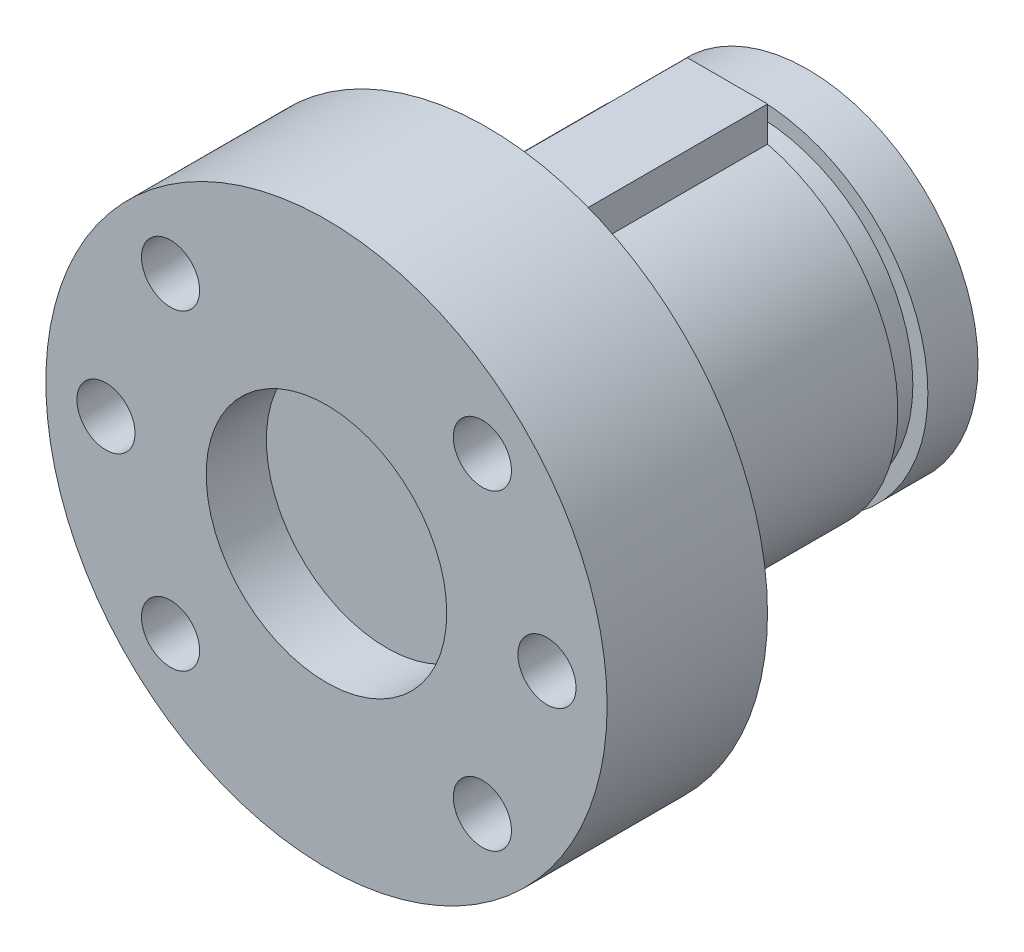
ISO-10303-21;
HEADER;
FILE_DESCRIPTION(('STEP AP214'),'2;1');
FILE_NAME('part.step','',(''),(''),'','','');
FILE_SCHEMA(('AUTOMOTIVE_DESIGN { 1 0 10303 214 1 1 1 1 }'));
ENDSEC;
DATA;
#1=APPLICATION_CONTEXT('core data for automotive mechanical design processes');
#2=APPLICATION_PROTOCOL_DEFINITION('international standard','automotive_design',2000,#1);
#3=PRODUCT_CONTEXT('',#1,'mechanical');
#4=PRODUCT('Part','Part','',(#3));
#5=PRODUCT_RELATED_PRODUCT_CATEGORY('part','',(#4));
#6=PRODUCT_DEFINITION_FORMATION('','',#4);
#7=PRODUCT_DEFINITION_CONTEXT('part definition',#1,'design');
#8=PRODUCT_DEFINITION('design','',#6,#7);
#9=PRODUCT_DEFINITION_SHAPE('','',#8);
#10=(LENGTH_UNIT() NAMED_UNIT(*) SI_UNIT(.MILLI.,.METRE.));
#11=(NAMED_UNIT(*) PLANE_ANGLE_UNIT() SI_UNIT($,.RADIAN.));
#12=(NAMED_UNIT(*) SI_UNIT($,.STERADIAN.) SOLID_ANGLE_UNIT());
#13=UNCERTAINTY_MEASURE_WITH_UNIT(LENGTH_MEASURE(1.E-05),#10,'distance_accuracy_value','');
#14=(GEOMETRIC_REPRESENTATION_CONTEXT(3) GLOBAL_UNCERTAINTY_ASSIGNED_CONTEXT((#13)) GLOBAL_UNIT_ASSIGNED_CONTEXT((#10,
#11,#12)) REPRESENTATION_CONTEXT('',''));
#15=CARTESIAN_POINT('',(0.,0.,0.));
#16=DIRECTION('',(0.,0.,1.));
#17=DIRECTION('',(1.,0.,0.));
#18=AXIS2_PLACEMENT_3D('',#15,#16,#17);
#19=CARTESIAN_POINT('',(0.,0.,25.8774509949834));
#20=DIRECTION('',(0.,0.,1.));
#21=DIRECTION('',(1.,0.,0.));
#22=AXIS2_PLACEMENT_3D('',#19,#20,#21);
#23=CYLINDRICAL_SURFACE('',#22,8.5);
#24=DIRECTION('',(0.,0.,1.));
#25=VECTOR('',#24,1.);
#26=CARTESIAN_POINT('',(2.,8.26135582092915,25.8774509949834));
#27=LINE('',#26,#25);
#28=CARTESIAN_POINT('',(2.,8.26135582092915,-8.));
#29=VERTEX_POINT('',#28);
#30=CARTESIAN_POINT('',(2.,8.26135582092915,-20.));
#31=VERTEX_POINT('',#30);
#32=EDGE_CURVE('E142',#29,#31,#27,.F.);
#33=ORIENTED_EDGE('',*,*,#32,.F.);
#34=CARTESIAN_POINT('',(0.,0.,-8.));
#35=DIRECTION('',(0.,0.,1.));
#36=DIRECTION('',(1.,0.,0.));
#37=AXIS2_PLACEMENT_3D('',#34,#35,#36);
#38=CIRCLE('',#37,8.5);
#39=CARTESIAN_POINT('',(5.21659146378121,6.71097410962112,-8.));
#40=VERTEX_POINT('',#39);
#41=EDGE_CURVE('E265',#40,#29,#38,.T.);
#42=ORIENTED_EDGE('',*,*,#41,.F.);
#43=CARTESIAN_POINT('',(6.71097410962113,5.2165914637812,-8.));
#44=VERTEX_POINT('',#43);
#45=EDGE_CURVE('E272',#44,#40,#38,.T.);
#46=ORIENTED_EDGE('',*,*,#45,.F.);
#47=CARTESIAN_POINT('',(8.4340625,1.0566881025609,-8.));
#48=VERTEX_POINT('',#47);
#49=EDGE_CURVE('E753',#48,#44,#38,.T.);
#50=ORIENTED_EDGE('',*,*,#49,.F.);
#51=CARTESIAN_POINT('',(8.43406250000051,-1.0566881025568,-8.));
#52=VERTEX_POINT('',#51);
#53=EDGE_CURVE('E751',#52,#48,#38,.T.);
#54=ORIENTED_EDGE('',*,*,#53,.F.);
#55=CARTESIAN_POINT('',(6.71097410962112,-5.21659146378121,-8.));
#56=VERTEX_POINT('',#55);
#57=EDGE_CURVE('E750',#56,#52,#38,.T.);
#58=ORIENTED_EDGE('',*,*,#57,.F.);
#59=CARTESIAN_POINT('',(5.21659146378121,-6.71097410962112,-8.));
#60=VERTEX_POINT('',#59);
#61=EDGE_CURVE('E264',#60,#56,#38,.T.);
#62=ORIENTED_EDGE('',*,*,#61,.F.);
#63=CARTESIAN_POINT('',(-5.21659146378121,-6.71097410962112,-8.));
#64=VERTEX_POINT('',#63);
#65=EDGE_CURVE('E257',#64,#60,#38,.T.);
#66=ORIENTED_EDGE('',*,*,#65,.F.);
#67=CARTESIAN_POINT('',(-6.71097410962112,-5.21659146378121,-8.));
#68=VERTEX_POINT('',#67);
#69=EDGE_CURVE('E45',#68,#64,#38,.T.);
#70=ORIENTED_EDGE('',*,*,#69,.F.);
#71=CARTESIAN_POINT('',(-8.4340625,-1.0566881025609,-8.));
#72=VERTEX_POINT('',#71);
#73=EDGE_CURVE('E255',#72,#68,#38,.T.);
#74=ORIENTED_EDGE('',*,*,#73,.F.);
#75=CARTESIAN_POINT('',(-8.4340625,1.0566881025609,-8.));
#76=VERTEX_POINT('',#75);
#77=EDGE_CURVE('E275',#76,#72,#38,.T.);
#78=ORIENTED_EDGE('',*,*,#77,.F.);
#79=CARTESIAN_POINT('',(-6.71097410962113,5.21659146378121,-8.));
#80=VERTEX_POINT('',#79);
#81=EDGE_CURVE('E274',#80,#76,#38,.T.);
#82=ORIENTED_EDGE('',*,*,#81,.F.);
#83=CARTESIAN_POINT('',(-5.21659146378121,6.71097410962112,-8.));
#84=VERTEX_POINT('',#83);
#85=EDGE_CURVE('E266',#84,#80,#38,.T.);
#86=ORIENTED_EDGE('',*,*,#85,.F.);
#87=CARTESIAN_POINT('',(-2.,8.26135582092915,-8.));
#88=VERTEX_POINT('',#87);
#89=EDGE_CURVE('E258',#88,#84,#38,.T.);
#90=ORIENTED_EDGE('',*,*,#89,.F.);
#91=DIRECTION('',(0.,0.,1.));
#92=VECTOR('',#91,1.);
#93=CARTESIAN_POINT('',(-2.,8.26135582092915,25.8774509949834));
#94=LINE('',#93,#92);
#95=CARTESIAN_POINT('',(-2.,8.26135582092915,-20.));
#96=VERTEX_POINT('',#95);
#97=EDGE_CURVE('E52',#88,#96,#94,.F.);
#98=ORIENTED_EDGE('',*,*,#97,.T.);
#99=CARTESIAN_POINT('',(0.,0.,-20.));
#100=DIRECTION('',(0.,0.,1.));
#101=DIRECTION('',(1.,0.,0.));
#102=AXIS2_PLACEMENT_3D('',#99,#100,#101);
#103=CIRCLE('',#102,8.5);
#104=EDGE_CURVE('E134',#96,#31,#103,.T.);
#105=ORIENTED_EDGE('',*,*,#104,.T.);
#106=EDGE_LOOP('',(#33,#42,#46,#50,#54,#58,#62,#66,#70,#74,#78,#82,#86,#90,#98,#105));
#107=FACE_BOUND('',#106,.T.);
#108=ADVANCED_FACE('F37',(#107),#23,.T.);
#109=CARTESIAN_POINT('',(0.,0.,-3.));
#110=DIRECTION('',(0.,0.,1.));
#111=DIRECTION('',(1.,0.,0.));
#112=AXIS2_PLACEMENT_3D('',#109,#110,#111);
#113=PLANE('',#112);
#114=CARTESIAN_POINT('',(0.,0.,-3.));
#115=DIRECTION('',(0.,0.,1.));
#116=DIRECTION('',(1.,0.,0.));
#117=AXIS2_PLACEMENT_3D('',#114,#115,#116);
#118=CIRCLE('',#117,6.);
#119=CARTESIAN_POINT('',(6.,0.,-3.));
#120=VERTEX_POINT('',#119);
#121=EDGE_CURVE('E244',#120,#120,#118,.T.);
#122=ORIENTED_EDGE('',*,*,#121,.T.);
#123=EDGE_LOOP('',(#122));
#124=FACE_BOUND('',#123,.T.);
#125=ADVANCED_FACE('F39',(#124),#113,.T.);
#126=CARTESIAN_POINT('',(14.,0.,-8.));
#127=DIRECTION('',(0.,0.,-1.));
#128=DIRECTION('',(-1.,0.,0.));
#129=AXIS2_PLACEMENT_3D('',#126,#127,#128);
#130=PLANE('',#129);
#131=DIRECTION('',(0.,1.,0.));
#132=VECTOR('',#131,1.);
#133=CARTESIAN_POINT('',(2.,10.,-8.));
#134=LINE('',#133,#132);
#135=CARTESIAN_POINT('',(2.,10.,-8.));
#136=VERTEX_POINT('',#135);
#137=EDGE_CURVE('E143',#29,#136,#134,.T.);
#138=ORIENTED_EDGE('',*,*,#137,.T.);
#139=DIRECTION('',(1.,0.,0.));
#140=VECTOR('',#139,1.);
#141=CARTESIAN_POINT('',(2.,10.,-8.));
#142=LINE('',#141,#140);
#143=CARTESIAN_POINT('',(-2.,10.,-8.));
#144=VERTEX_POINT('',#143);
#145=EDGE_CURVE('E765',#144,#136,#142,.T.);
#146=ORIENTED_EDGE('',*,*,#145,.F.);
#147=DIRECTION('',(0.,1.,0.));
#148=VECTOR('',#147,1.);
#149=CARTESIAN_POINT('',(-2.,10.,-8.));
#150=LINE('',#149,#148);
#151=EDGE_CURVE('E117',#88,#144,#150,.T.);
#152=ORIENTED_EDGE('',*,*,#151,.F.);
#153=ORIENTED_EDGE('',*,*,#89,.T.);
#154=CARTESIAN_POINT('',(-7.77817459305202,7.77817459305202,-8.));
#155=DIRECTION('',(0.,0.,-1.));
#156=DIRECTION('',(-1.,0.,0.));
#157=AXIS2_PLACEMENT_3D('',#154,#155,#156);
#158=CIRCLE('',#157,2.775);
#159=EDGE_CURVE('E169',#80,#84,#158,.T.);
#160=ORIENTED_EDGE('',*,*,#159,.F.);
#161=ORIENTED_EDGE('',*,*,#81,.T.);
#162=CARTESIAN_POINT('',(-11.,0.,-8.));
#163=DIRECTION('',(0.,0.,-1.));
#164=DIRECTION('',(-1.,0.,0.));
#165=AXIS2_PLACEMENT_3D('',#162,#163,#164);
#166=CIRCLE('',#165,2.775);
#167=EDGE_CURVE('E155',#72,#76,#166,.T.);
#168=ORIENTED_EDGE('',*,*,#167,.F.);
#169=ORIENTED_EDGE('',*,*,#73,.T.);
#170=CARTESIAN_POINT('',(-7.77817459305202,-7.77817459305202,-8.));
#171=DIRECTION('',(0.,0.,-1.));
#172=DIRECTION('',(-1.,0.,0.));
#173=AXIS2_PLACEMENT_3D('',#170,#171,#172);
#174=CIRCLE('',#173,2.775);
#175=EDGE_CURVE('E229',#64,#68,#174,.T.);
#176=ORIENTED_EDGE('',*,*,#175,.F.);
#177=ORIENTED_EDGE('',*,*,#65,.T.);
#178=CARTESIAN_POINT('',(7.77817459305202,-7.77817459305202,-8.));
#179=DIRECTION('',(0.,0.,-1.));
#180=DIRECTION('',(-1.,0.,0.));
#181=AXIS2_PLACEMENT_3D('',#178,#179,#180);
#182=CIRCLE('',#181,2.775);
#183=EDGE_CURVE('E214',#56,#60,#182,.T.);
#184=ORIENTED_EDGE('',*,*,#183,.F.);
#185=ORIENTED_EDGE('',*,*,#57,.T.);
#186=CARTESIAN_POINT('',(11.,0.,-8.));
#187=DIRECTION('',(0.,0.,-1.));
#188=DIRECTION('',(-1.,0.,0.));
#189=AXIS2_PLACEMENT_3D('',#186,#187,#188);
#190=CIRCLE('',#189,2.775);
#191=EDGE_CURVE('E200',#48,#52,#190,.T.);
#192=ORIENTED_EDGE('',*,*,#191,.F.);
#193=ORIENTED_EDGE('',*,*,#49,.T.);
#194=CARTESIAN_POINT('',(7.77817459305202,7.77817459305202,-8.));
#195=DIRECTION('',(0.,0.,-1.));
#196=DIRECTION('',(-1.,0.,0.));
#197=AXIS2_PLACEMENT_3D('',#194,#195,#196);
#198=CIRCLE('',#197,2.775);
#199=EDGE_CURVE('E184',#40,#44,#198,.T.);
#200=ORIENTED_EDGE('',*,*,#199,.F.);
#201=ORIENTED_EDGE('',*,*,#41,.T.);
#202=EDGE_LOOP('',(#138,#146,#152,#153,#160,#161,#168,#169,#176,#177,#184,#185,#192,#193,#200,#201));
#203=FACE_BOUND('',#202,.T.);
#204=CARTESIAN_POINT('',(0.,0.,-8.));
#205=DIRECTION('',(0.,0.,1.));
#206=DIRECTION('',(1.,0.,0.));
#207=AXIS2_PLACEMENT_3D('',#204,#205,#206);
#208=CIRCLE('',#207,14.);
#209=CARTESIAN_POINT('',(14.,0.,-8.));
#210=VERTEX_POINT('',#209);
#211=EDGE_CURVE('E253',#210,#210,#208,.T.);
#212=ORIENTED_EDGE('',*,*,#211,.F.);
#213=EDGE_LOOP('',(#212));
#214=FACE_BOUND('',#213,.T.);
#215=ADVANCED_FACE('F284',(#203,#214),#130,.T.);
#216=CARTESIAN_POINT('',(0.,0.,25.8774509949834));
#217=DIRECTION('',(0.,0.,1.));
#218=DIRECTION('',(1.,0.,0.));
#219=AXIS2_PLACEMENT_3D('',#216,#217,#218);
#220=CYLINDRICAL_SURFACE('',#219,14.);
#221=ORIENTED_EDGE('',*,*,#211,.T.);
#222=EDGE_LOOP('',(#221));
#223=FACE_BOUND('',#222,.T.);
#224=CARTESIAN_POINT('',(0.,0.,0.));
#225=DIRECTION('',(0.,0.,1.));
#226=DIRECTION('',(1.,0.,0.));
#227=AXIS2_PLACEMENT_3D('',#224,#225,#226);
#228=CIRCLE('',#227,14.);
#229=CARTESIAN_POINT('',(14.,0.,0.));
#230=VERTEX_POINT('',#229);
#231=EDGE_CURVE('E250',#230,#230,#228,.T.);
#232=ORIENTED_EDGE('',*,*,#231,.F.);
#233=EDGE_LOOP('',(#232));
#234=FACE_BOUND('',#233,.T.);
#235=ADVANCED_FACE('F629',(#223,#234),#220,.T.);
#236=CARTESIAN_POINT('',(6.,0.,0.));
#237=DIRECTION('',(0.,0.,1.));
#238=DIRECTION('',(1.,0.,0.));
#239=AXIS2_PLACEMENT_3D('',#236,#237,#238);
#240=PLANE('',#239);
#241=CARTESIAN_POINT('',(-11.,0.,0.));
#242=DIRECTION('',(0.,0.,-1.));
#243=DIRECTION('',(-1.,0.,0.));
#244=AXIS2_PLACEMENT_3D('',#241,#242,#243);
#245=CIRCLE('',#244,1.45);
#246=CARTESIAN_POINT('',(-12.45,0.,0.));
#247=VERTEX_POINT('',#246);
#248=EDGE_CURVE('E166',#247,#247,#245,.T.);
#249=ORIENTED_EDGE('',*,*,#248,.T.);
#250=EDGE_LOOP('',(#249));
#251=FACE_BOUND('',#250,.T.);
#252=CARTESIAN_POINT('',(-7.77817459305202,7.77817459305202,0.));
#253=DIRECTION('',(0.,0.,-1.));
#254=DIRECTION('',(-1.,0.,0.));
#255=AXIS2_PLACEMENT_3D('',#252,#253,#254);
#256=CIRCLE('',#255,1.45);
#257=CARTESIAN_POINT('',(-9.22817459305202,7.77817459305202,0.));
#258=VERTEX_POINT('',#257);
#259=EDGE_CURVE('E181',#258,#258,#256,.T.);
#260=ORIENTED_EDGE('',*,*,#259,.T.);
#261=EDGE_LOOP('',(#260));
#262=FACE_BOUND('',#261,.T.);
#263=CARTESIAN_POINT('',(7.77817459305202,7.77817459305202,0.));
#264=DIRECTION('',(0.,0.,-1.));
#265=DIRECTION('',(-1.,0.,0.));
#266=AXIS2_PLACEMENT_3D('',#263,#264,#265);
#267=CIRCLE('',#266,1.45);
#268=CARTESIAN_POINT('',(6.32817459305203,7.77817459305202,0.));
#269=VERTEX_POINT('',#268);
#270=EDGE_CURVE('E196',#269,#269,#267,.T.);
#271=ORIENTED_EDGE('',*,*,#270,.T.);
#272=EDGE_LOOP('',(#271));
#273=FACE_BOUND('',#272,.T.);
#274=CARTESIAN_POINT('',(11.,0.,0.));
#275=DIRECTION('',(0.,0.,-1.));
#276=DIRECTION('',(-1.,0.,0.));
#277=AXIS2_PLACEMENT_3D('',#274,#275,#276);
#278=CIRCLE('',#277,1.45);
#279=CARTESIAN_POINT('',(9.55,0.,0.));
#280=VERTEX_POINT('',#279);
#281=EDGE_CURVE('E211',#280,#280,#278,.T.);
#282=ORIENTED_EDGE('',*,*,#281,.T.);
#283=EDGE_LOOP('',(#282));
#284=FACE_BOUND('',#283,.T.);
#285=CARTESIAN_POINT('',(7.77817459305202,-7.77817459305202,0.));
#286=DIRECTION('',(0.,0.,-1.));
#287=DIRECTION('',(-1.,0.,0.));
#288=AXIS2_PLACEMENT_3D('',#285,#286,#287);
#289=CIRCLE('',#288,1.45);
#290=CARTESIAN_POINT('',(6.32817459305202,-7.77817459305202,0.));
#291=VERTEX_POINT('',#290);
#292=EDGE_CURVE('E226',#291,#291,#289,.T.);
#293=ORIENTED_EDGE('',*,*,#292,.T.);
#294=EDGE_LOOP('',(#293));
#295=FACE_BOUND('',#294,.T.);
#296=CARTESIAN_POINT('',(-7.77817459305202,-7.77817459305202,0.));
#297=DIRECTION('',(0.,0.,-1.));
#298=DIRECTION('',(-1.,0.,0.));
#299=AXIS2_PLACEMENT_3D('',#296,#297,#298);
#300=CIRCLE('',#299,1.45);
#301=CARTESIAN_POINT('',(-9.22817459305202,-7.77817459305202,0.));
#302=VERTEX_POINT('',#301);
#303=EDGE_CURVE('E241',#302,#302,#300,.T.);
#304=ORIENTED_EDGE('',*,*,#303,.T.);
#305=EDGE_LOOP('',(#304));
#306=FACE_BOUND('',#305,.T.);
#307=ORIENTED_EDGE('',*,*,#231,.T.);
#308=EDGE_LOOP('',(#307));
#309=FACE_BOUND('',#308,.T.);
#310=CARTESIAN_POINT('',(0.,0.,0.));
#311=DIRECTION('',(0.,0.,1.));
#312=DIRECTION('',(1.,0.,0.));
#313=AXIS2_PLACEMENT_3D('',#310,#311,#312);
#314=CIRCLE('',#313,6.);
#315=CARTESIAN_POINT('',(6.,0.,0.));
#316=VERTEX_POINT('',#315);
#317=EDGE_CURVE('E247',#316,#316,#314,.T.);
#318=ORIENTED_EDGE('',*,*,#317,.F.);
#319=EDGE_LOOP('',(#318));
#320=FACE_BOUND('',#319,.T.);
#321=ADVANCED_FACE('F309',(#251,#262,#273,#284,#295,#306,#309,#320),#240,.T.);
#322=CARTESIAN_POINT('',(0.,0.,25.8774509949834));
#323=DIRECTION('',(0.,0.,1.));
#324=DIRECTION('',(1.,0.,0.));
#325=AXIS2_PLACEMENT_3D('',#322,#323,#324);
#326=CYLINDRICAL_SURFACE('',#325,6.);
#327=ORIENTED_EDGE('',*,*,#317,.T.);
#328=EDGE_LOOP('',(#327));
#329=FACE_BOUND('',#328,.T.);
#330=ORIENTED_EDGE('',*,*,#121,.F.);
#331=EDGE_LOOP('',(#330));
#332=FACE_BOUND('',#331,.T.);
#333=ADVANCED_FACE('F300',(#329,#332),#326,.F.);
#334=CARTESIAN_POINT('',(-5.00317459305202,-7.77817459305202,-8.));
#335=DIRECTION('',(0.,0.,-1.));
#336=DIRECTION('',(-1.,0.,0.));
#337=AXIS2_PLACEMENT_3D('',#334,#335,#336);
#338=PLANE('',#337);
#339=ORIENTED_EDGE('',*,*,#69,.T.);
#340=EDGE_CURVE('E230',#68,#64,#174,.T.);
#341=ORIENTED_EDGE('',*,*,#340,.F.);
#342=EDGE_LOOP('',(#339,#341));
#343=FACE_BOUND('',#342,.T.);
#344=ADVANCED_FACE('F297',(#343),#338,.F.);
#345=CARTESIAN_POINT('',(-7.77817459305202,-7.77817459305202,-8.));
#346=DIRECTION('',(0.,0.,-1.));
#347=DIRECTION('',(-1.,0.,0.));
#348=AXIS2_PLACEMENT_3D('',#345,#346,#347);
#349=CYLINDRICAL_SURFACE('',#348,1.45);
#350=ORIENTED_EDGE('',*,*,#303,.F.);
#351=EDGE_LOOP('',(#350));
#352=FACE_BOUND('',#351,.T.);
#353=CARTESIAN_POINT('',(-7.77817459305202,-7.77817459305202,-5.5));
#354=DIRECTION('',(0.,0.,-1.));
#355=DIRECTION('',(-1.,0.,0.));
#356=AXIS2_PLACEMENT_3D('',#353,#354,#355);
#357=CIRCLE('',#356,1.45);
#358=CARTESIAN_POINT('',(-9.22817459305202,-7.77817459305202,-5.5));
#359=VERTEX_POINT('',#358);
#360=EDGE_CURVE('E238',#359,#359,#357,.T.);
#361=ORIENTED_EDGE('',*,*,#360,.T.);
#362=EDGE_LOOP('',(#361));
#363=FACE_BOUND('',#362,.T.);
#364=ADVANCED_FACE('F299',(#352,#363),#349,.F.);
#365=CARTESIAN_POINT('',(-5.02817459305202,-7.77817459305202,-5.5));
#366=DIRECTION('',(0.,0.,1.));
#367=DIRECTION('',(1.,0.,0.));
#368=AXIS2_PLACEMENT_3D('',#365,#366,#367);
#369=PLANE('',#368);
#370=ORIENTED_EDGE('',*,*,#360,.F.);
#371=EDGE_LOOP('',(#370));
#372=FACE_BOUND('',#371,.T.);
#373=CARTESIAN_POINT('',(-7.77817459305202,-7.77817459305202,-5.5));
#374=DIRECTION('',(0.,0.,-1.));
#375=DIRECTION('',(-1.,0.,0.));
#376=AXIS2_PLACEMENT_3D('',#373,#374,#375);
#377=CIRCLE('',#376,2.75);
#378=CARTESIAN_POINT('',(-10.528174593052,-7.77817459305202,-5.5));
#379=VERTEX_POINT('',#378);
#380=EDGE_CURVE('E235',#379,#379,#377,.T.);
#381=ORIENTED_EDGE('',*,*,#380,.T.);
#382=EDGE_LOOP('',(#381));
#383=FACE_BOUND('',#382,.T.);
#384=ADVANCED_FACE('F306',(#372,#383),#369,.F.);
#385=CARTESIAN_POINT('',(-7.77817459305202,-7.77817459305202,-8.));
#386=DIRECTION('',(0.,0.,-1.));
#387=DIRECTION('',(-1.,0.,0.));
#388=AXIS2_PLACEMENT_3D('',#385,#386,#387);
#389=CYLINDRICAL_SURFACE('',#388,2.75);
#390=ORIENTED_EDGE('',*,*,#380,.F.);
#391=EDGE_LOOP('',(#390));
#392=FACE_BOUND('',#391,.T.);
#393=CARTESIAN_POINT('',(-7.77817459305202,-7.77817459305202,-7.975));
#394=DIRECTION('',(0.,0.,-1.));
#395=DIRECTION('',(-1.,0.,0.));
#396=AXIS2_PLACEMENT_3D('',#393,#394,#395);
#397=CIRCLE('',#396,2.75);
#398=CARTESIAN_POINT('',(-10.528174593052,-7.77817459305202,-7.975));
#399=VERTEX_POINT('',#398);
#400=EDGE_CURVE('E232',#399,#399,#397,.T.);
#401=ORIENTED_EDGE('',*,*,#400,.T.);
#402=EDGE_LOOP('',(#401));
#403=FACE_BOUND('',#402,.T.);
#404=ADVANCED_FACE('F451',(#392,#403),#389,.F.);
#405=CARTESIAN_POINT('',(-7.77817459305202,-7.77817459305202,-8.));
#406=DIRECTION('',(0.,0.,-1.));
#407=DIRECTION('',(-1.,0.,0.));
#408=AXIS2_PLACEMENT_3D('',#405,#406,#407);
#409=CONICAL_SURFACE('',#408,2.775,0.785398163397448);
#410=ORIENTED_EDGE('',*,*,#400,.F.);
#411=EDGE_LOOP('',(#410));
#412=FACE_BOUND('',#411,.T.);
#413=ORIENTED_EDGE('',*,*,#340,.T.);
#414=ORIENTED_EDGE('',*,*,#175,.T.);
#415=EDGE_LOOP('',(#413,#414));
#416=FACE_BOUND('',#415,.T.);
#417=ADVANCED_FACE('F296',(#412,#416),#409,.F.);
#418=CARTESIAN_POINT('',(10.553174593052,-7.77817459305202,-8.));
#419=DIRECTION('',(0.,0.,-1.));
#420=DIRECTION('',(-1.,0.,0.));
#421=AXIS2_PLACEMENT_3D('',#418,#419,#420);
#422=PLANE('',#421);
#423=ORIENTED_EDGE('',*,*,#61,.T.);
#424=EDGE_CURVE('E215',#60,#56,#182,.T.);
#425=ORIENTED_EDGE('',*,*,#424,.F.);
#426=EDGE_LOOP('',(#423,#425));
#427=FACE_BOUND('',#426,.T.);
#428=ADVANCED_FACE('F444',(#427),#422,.F.);
#429=CARTESIAN_POINT('',(7.77817459305202,-7.77817459305202,-8.));
#430=DIRECTION('',(0.,0.,-1.));
#431=DIRECTION('',(-1.,0.,0.));
#432=AXIS2_PLACEMENT_3D('',#429,#430,#431);
#433=CYLINDRICAL_SURFACE('',#432,1.45);
#434=ORIENTED_EDGE('',*,*,#292,.F.);
#435=EDGE_LOOP('',(#434));
#436=FACE_BOUND('',#435,.T.);
#437=CARTESIAN_POINT('',(7.77817459305202,-7.77817459305202,-5.5));
#438=DIRECTION('',(0.,0.,-1.));
#439=DIRECTION('',(-1.,0.,0.));
#440=AXIS2_PLACEMENT_3D('',#437,#438,#439);
#441=CIRCLE('',#440,1.45);
#442=CARTESIAN_POINT('',(6.32817459305202,-7.77817459305202,-5.5));
#443=VERTEX_POINT('',#442);
#444=EDGE_CURVE('E223',#443,#443,#441,.T.);
#445=ORIENTED_EDGE('',*,*,#444,.T.);
#446=EDGE_LOOP('',(#445));
#447=FACE_BOUND('',#446,.T.);
#448=ADVANCED_FACE('F440',(#436,#447),#433,.F.);
#449=CARTESIAN_POINT('',(10.528174593052,-7.77817459305202,-5.5));
#450=DIRECTION('',(0.,0.,1.));
#451=DIRECTION('',(1.,0.,0.));
#452=AXIS2_PLACEMENT_3D('',#449,#450,#451);
#453=PLANE('',#452);
#454=ORIENTED_EDGE('',*,*,#444,.F.);
#455=EDGE_LOOP('',(#454));
#456=FACE_BOUND('',#455,.T.);
#457=CARTESIAN_POINT('',(7.77817459305202,-7.77817459305202,-5.5));
#458=DIRECTION('',(0.,0.,-1.));
#459=DIRECTION('',(-1.,0.,0.));
#460=AXIS2_PLACEMENT_3D('',#457,#458,#459);
#461=CIRCLE('',#460,2.75);
#462=CARTESIAN_POINT('',(5.02817459305202,-7.77817459305202,-5.5));
#463=VERTEX_POINT('',#462);
#464=EDGE_CURVE('E220',#463,#463,#461,.T.);
#465=ORIENTED_EDGE('',*,*,#464,.T.);
#466=EDGE_LOOP('',(#465));
#467=FACE_BOUND('',#466,.T.);
#468=ADVANCED_FACE('F436',(#456,#467),#453,.F.);
#469=CARTESIAN_POINT('',(7.77817459305202,-7.77817459305202,-8.));
#470=DIRECTION('',(0.,0.,-1.));
#471=DIRECTION('',(-1.,0.,0.));
#472=AXIS2_PLACEMENT_3D('',#469,#470,#471);
#473=CYLINDRICAL_SURFACE('',#472,2.75);
#474=ORIENTED_EDGE('',*,*,#464,.F.);
#475=EDGE_LOOP('',(#474));
#476=FACE_BOUND('',#475,.T.);
#477=CARTESIAN_POINT('',(7.77817459305202,-7.77817459305202,-7.975));
#478=DIRECTION('',(0.,0.,-1.));
#479=DIRECTION('',(-1.,0.,0.));
#480=AXIS2_PLACEMENT_3D('',#477,#478,#479);
#481=CIRCLE('',#480,2.75);
#482=CARTESIAN_POINT('',(5.02817459305202,-7.77817459305202,-7.975));
#483=VERTEX_POINT('',#482);
#484=EDGE_CURVE('E217',#483,#483,#481,.T.);
#485=ORIENTED_EDGE('',*,*,#484,.T.);
#486=EDGE_LOOP('',(#485));
#487=FACE_BOUND('',#486,.T.);
#488=ADVANCED_FACE('F432',(#476,#487),#473,.F.);
#489=CARTESIAN_POINT('',(7.77817459305202,-7.77817459305202,-8.));
#490=DIRECTION('',(0.,0.,-1.));
#491=DIRECTION('',(-1.,0.,0.));
#492=AXIS2_PLACEMENT_3D('',#489,#490,#491);
#493=CONICAL_SURFACE('',#492,2.775,0.785398163397448);
#494=ORIENTED_EDGE('',*,*,#484,.F.);
#495=EDGE_LOOP('',(#494));
#496=FACE_BOUND('',#495,.T.);
#497=ORIENTED_EDGE('',*,*,#424,.T.);
#498=ORIENTED_EDGE('',*,*,#183,.T.);
#499=EDGE_LOOP('',(#497,#498));
#500=FACE_BOUND('',#499,.T.);
#501=ADVANCED_FACE('F428',(#496,#500),#493,.F.);
#502=CARTESIAN_POINT('',(13.775,0.,-8.));
#503=DIRECTION('',(0.,0.,-1.));
#504=DIRECTION('',(-1.,0.,0.));
#505=AXIS2_PLACEMENT_3D('',#502,#503,#504);
#506=PLANE('',#505);
#507=ORIENTED_EDGE('',*,*,#53,.T.);
#508=EDGE_CURVE('E199',#52,#48,#190,.T.);
#509=ORIENTED_EDGE('',*,*,#508,.F.);
#510=EDGE_LOOP('',(#507,#509));
#511=FACE_BOUND('',#510,.T.);
#512=ADVANCED_FACE('F424',(#511),#506,.F.);
#513=CARTESIAN_POINT('',(11.,0.,-8.));
#514=DIRECTION('',(0.,0.,-1.));
#515=DIRECTION('',(-1.,0.,0.));
#516=AXIS2_PLACEMENT_3D('',#513,#514,#515);
#517=CYLINDRICAL_SURFACE('',#516,1.45);
#518=ORIENTED_EDGE('',*,*,#281,.F.);
#519=EDGE_LOOP('',(#518));
#520=FACE_BOUND('',#519,.T.);
#521=CARTESIAN_POINT('',(11.,0.,-5.5));
#522=DIRECTION('',(0.,0.,-1.));
#523=DIRECTION('',(-1.,0.,0.));
#524=AXIS2_PLACEMENT_3D('',#521,#522,#523);
#525=CIRCLE('',#524,1.45);
#526=CARTESIAN_POINT('',(9.55,0.,-5.5));
#527=VERTEX_POINT('',#526);
#528=EDGE_CURVE('E208',#527,#527,#525,.T.);
#529=ORIENTED_EDGE('',*,*,#528,.T.);
#530=EDGE_LOOP('',(#529));
#531=FACE_BOUND('',#530,.T.);
#532=ADVANCED_FACE('F420',(#520,#531),#517,.F.);
#533=CARTESIAN_POINT('',(13.75,0.,-5.5));
#534=DIRECTION('',(0.,0.,1.));
#535=DIRECTION('',(1.,0.,0.));
#536=AXIS2_PLACEMENT_3D('',#533,#534,#535);
#537=PLANE('',#536);
#538=ORIENTED_EDGE('',*,*,#528,.F.);
#539=EDGE_LOOP('',(#538));
#540=FACE_BOUND('',#539,.T.);
#541=CARTESIAN_POINT('',(11.,0.,-5.5));
#542=DIRECTION('',(0.,0.,-1.));
#543=DIRECTION('',(-1.,0.,0.));
#544=AXIS2_PLACEMENT_3D('',#541,#542,#543);
#545=CIRCLE('',#544,2.75);
#546=CARTESIAN_POINT('',(8.25,0.,-5.5));
#547=VERTEX_POINT('',#546);
#548=EDGE_CURVE('E205',#547,#547,#545,.T.);
#549=ORIENTED_EDGE('',*,*,#548,.T.);
#550=EDGE_LOOP('',(#549));
#551=FACE_BOUND('',#550,.T.);
#552=ADVANCED_FACE('F416',(#540,#551),#537,.F.);
#553=CARTESIAN_POINT('',(11.,0.,-8.));
#554=DIRECTION('',(0.,0.,-1.));
#555=DIRECTION('',(-1.,0.,0.));
#556=AXIS2_PLACEMENT_3D('',#553,#554,#555);
#557=CYLINDRICAL_SURFACE('',#556,2.75);
#558=ORIENTED_EDGE('',*,*,#548,.F.);
#559=EDGE_LOOP('',(#558));
#560=FACE_BOUND('',#559,.T.);
#561=CARTESIAN_POINT('',(11.,0.,-7.975));
#562=DIRECTION('',(0.,0.,-1.));
#563=DIRECTION('',(-1.,0.,0.));
#564=AXIS2_PLACEMENT_3D('',#561,#562,#563);
#565=CIRCLE('',#564,2.75);
#566=CARTESIAN_POINT('',(8.25,0.,-7.975));
#567=VERTEX_POINT('',#566);
#568=EDGE_CURVE('E202',#567,#567,#565,.T.);
#569=ORIENTED_EDGE('',*,*,#568,.T.);
#570=EDGE_LOOP('',(#569));
#571=FACE_BOUND('',#570,.T.);
#572=ADVANCED_FACE('F412',(#560,#571),#557,.F.);
#573=CARTESIAN_POINT('',(11.,0.,-8.));
#574=DIRECTION('',(0.,0.,-1.));
#575=DIRECTION('',(-1.,0.,0.));
#576=AXIS2_PLACEMENT_3D('',#573,#574,#575);
#577=CONICAL_SURFACE('',#576,2.775,0.785398163397448);
#578=ORIENTED_EDGE('',*,*,#568,.F.);
#579=EDGE_LOOP('',(#578));
#580=FACE_BOUND('',#579,.T.);
#581=ORIENTED_EDGE('',*,*,#191,.T.);
#582=ORIENTED_EDGE('',*,*,#508,.T.);
#583=EDGE_LOOP('',(#581,#582));
#584=FACE_BOUND('',#583,.T.);
#585=ADVANCED_FACE('F408',(#580,#584),#577,.F.);
#586=CARTESIAN_POINT('',(10.553174593052,7.77817459305202,-8.));
#587=DIRECTION('',(0.,0.,-1.));
#588=DIRECTION('',(-1.,0.,0.));
#589=AXIS2_PLACEMENT_3D('',#586,#587,#588);
#590=PLANE('',#589);
#591=ORIENTED_EDGE('',*,*,#45,.T.);
#592=EDGE_CURVE('E185',#44,#40,#198,.T.);
#593=ORIENTED_EDGE('',*,*,#592,.F.);
#594=EDGE_LOOP('',(#591,#593));
#595=FACE_BOUND('',#594,.T.);
#596=ADVANCED_FACE('F404',(#595),#590,.F.);
#597=CARTESIAN_POINT('',(7.77817459305202,7.77817459305202,-8.));
#598=DIRECTION('',(0.,0.,-1.));
#599=DIRECTION('',(-1.,0.,0.));
#600=AXIS2_PLACEMENT_3D('',#597,#598,#599);
#601=CYLINDRICAL_SURFACE('',#600,1.45);
#602=ORIENTED_EDGE('',*,*,#270,.F.);
#603=EDGE_LOOP('',(#602));
#604=FACE_BOUND('',#603,.T.);
#605=CARTESIAN_POINT('',(7.77817459305202,7.77817459305202,-5.5));
#606=DIRECTION('',(0.,0.,-1.));
#607=DIRECTION('',(-1.,0.,0.));
#608=AXIS2_PLACEMENT_3D('',#605,#606,#607);
#609=CIRCLE('',#608,1.45);
#610=CARTESIAN_POINT('',(6.32817459305202,7.77817459305202,-5.5));
#611=VERTEX_POINT('',#610);
#612=EDGE_CURVE('E193',#611,#611,#609,.T.);
#613=ORIENTED_EDGE('',*,*,#612,.T.);
#614=EDGE_LOOP('',(#613));
#615=FACE_BOUND('',#614,.T.);
#616=ADVANCED_FACE('F400',(#604,#615),#601,.F.);
#617=CARTESIAN_POINT('',(10.528174593052,7.77817459305202,-5.5));
#618=DIRECTION('',(0.,0.,1.));
#619=DIRECTION('',(1.,0.,0.));
#620=AXIS2_PLACEMENT_3D('',#617,#618,#619);
#621=PLANE('',#620);
#622=ORIENTED_EDGE('',*,*,#612,.F.);
#623=EDGE_LOOP('',(#622));
#624=FACE_BOUND('',#623,.T.);
#625=CARTESIAN_POINT('',(7.77817459305202,7.77817459305202,-5.5));
#626=DIRECTION('',(0.,0.,-1.));
#627=DIRECTION('',(-1.,0.,0.));
#628=AXIS2_PLACEMENT_3D('',#625,#626,#627);
#629=CIRCLE('',#628,2.75);
#630=CARTESIAN_POINT('',(5.02817459305202,7.77817459305202,-5.5));
#631=VERTEX_POINT('',#630);
#632=EDGE_CURVE('E190',#631,#631,#629,.T.);
#633=ORIENTED_EDGE('',*,*,#632,.T.);
#634=EDGE_LOOP('',(#633));
#635=FACE_BOUND('',#634,.T.);
#636=ADVANCED_FACE('F396',(#624,#635),#621,.F.);
#637=CARTESIAN_POINT('',(7.77817459305202,7.77817459305202,-8.));
#638=DIRECTION('',(0.,0.,-1.));
#639=DIRECTION('',(-1.,0.,0.));
#640=AXIS2_PLACEMENT_3D('',#637,#638,#639);
#641=CYLINDRICAL_SURFACE('',#640,2.75);
#642=ORIENTED_EDGE('',*,*,#632,.F.);
#643=EDGE_LOOP('',(#642));
#644=FACE_BOUND('',#643,.T.);
#645=CARTESIAN_POINT('',(7.77817459305202,7.77817459305202,-7.975));
#646=DIRECTION('',(0.,0.,-1.));
#647=DIRECTION('',(-1.,0.,0.));
#648=AXIS2_PLACEMENT_3D('',#645,#646,#647);
#649=CIRCLE('',#648,2.75);
#650=CARTESIAN_POINT('',(5.02817459305202,7.77817459305202,-7.975));
#651=VERTEX_POINT('',#650);
#652=EDGE_CURVE('E187',#651,#651,#649,.T.);
#653=ORIENTED_EDGE('',*,*,#652,.T.);
#654=EDGE_LOOP('',(#653));
#655=FACE_BOUND('',#654,.T.);
#656=ADVANCED_FACE('F392',(#644,#655),#641,.F.);
#657=CARTESIAN_POINT('',(7.77817459305202,7.77817459305202,-8.));
#658=DIRECTION('',(0.,0.,-1.));
#659=DIRECTION('',(-1.,0.,0.));
#660=AXIS2_PLACEMENT_3D('',#657,#658,#659);
#661=CONICAL_SURFACE('',#660,2.775,0.785398163397448);
#662=ORIENTED_EDGE('',*,*,#652,.F.);
#663=EDGE_LOOP('',(#662));
#664=FACE_BOUND('',#663,.T.);
#665=ORIENTED_EDGE('',*,*,#592,.T.);
#666=ORIENTED_EDGE('',*,*,#199,.T.);
#667=EDGE_LOOP('',(#665,#666));
#668=FACE_BOUND('',#667,.T.);
#669=ADVANCED_FACE('F388',(#664,#668),#661,.F.);
#670=CARTESIAN_POINT('',(-5.00317459305202,7.77817459305202,-8.));
#671=DIRECTION('',(0.,0.,-1.));
#672=DIRECTION('',(-1.,0.,0.));
#673=AXIS2_PLACEMENT_3D('',#670,#671,#672);
#674=PLANE('',#673);
#675=ORIENTED_EDGE('',*,*,#85,.T.);
#676=EDGE_CURVE('E170',#84,#80,#158,.T.);
#677=ORIENTED_EDGE('',*,*,#676,.F.);
#678=EDGE_LOOP('',(#675,#677));
#679=FACE_BOUND('',#678,.T.);
#680=ADVANCED_FACE('F384',(#679),#674,.F.);
#681=CARTESIAN_POINT('',(-7.77817459305202,7.77817459305202,-8.));
#682=DIRECTION('',(0.,0.,-1.));
#683=DIRECTION('',(-1.,0.,0.));
#684=AXIS2_PLACEMENT_3D('',#681,#682,#683);
#685=CYLINDRICAL_SURFACE('',#684,1.45);
#686=ORIENTED_EDGE('',*,*,#259,.F.);
#687=EDGE_LOOP('',(#686));
#688=FACE_BOUND('',#687,.T.);
#689=CARTESIAN_POINT('',(-7.77817459305202,7.77817459305202,-5.5));
#690=DIRECTION('',(0.,0.,-1.));
#691=DIRECTION('',(-1.,0.,0.));
#692=AXIS2_PLACEMENT_3D('',#689,#690,#691);
#693=CIRCLE('',#692,1.45);
#694=CARTESIAN_POINT('',(-9.22817459305202,7.77817459305202,-5.5));
#695=VERTEX_POINT('',#694);
#696=EDGE_CURVE('E178',#695,#695,#693,.T.);
#697=ORIENTED_EDGE('',*,*,#696,.T.);
#698=EDGE_LOOP('',(#697));
#699=FACE_BOUND('',#698,.T.);
#700=ADVANCED_FACE('F380',(#688,#699),#685,.F.);
#701=CARTESIAN_POINT('',(-5.02817459305202,7.77817459305202,-5.5));
#702=DIRECTION('',(0.,0.,1.));
#703=DIRECTION('',(1.,0.,0.));
#704=AXIS2_PLACEMENT_3D('',#701,#702,#703);
#705=PLANE('',#704);
#706=ORIENTED_EDGE('',*,*,#696,.F.);
#707=EDGE_LOOP('',(#706));
#708=FACE_BOUND('',#707,.T.);
#709=CARTESIAN_POINT('',(-7.77817459305202,7.77817459305202,-5.5));
#710=DIRECTION('',(0.,0.,-1.));
#711=DIRECTION('',(-1.,0.,0.));
#712=AXIS2_PLACEMENT_3D('',#709,#710,#711);
#713=CIRCLE('',#712,2.75);
#714=CARTESIAN_POINT('',(-10.528174593052,7.77817459305202,-5.5));
#715=VERTEX_POINT('',#714);
#716=EDGE_CURVE('E175',#715,#715,#713,.T.);
#717=ORIENTED_EDGE('',*,*,#716,.T.);
#718=EDGE_LOOP('',(#717));
#719=FACE_BOUND('',#718,.T.);
#720=ADVANCED_FACE('F376',(#708,#719),#705,.F.);
#721=CARTESIAN_POINT('',(-7.77817459305202,7.77817459305202,-8.));
#722=DIRECTION('',(0.,0.,-1.));
#723=DIRECTION('',(-1.,0.,0.));
#724=AXIS2_PLACEMENT_3D('',#721,#722,#723);
#725=CYLINDRICAL_SURFACE('',#724,2.75);
#726=ORIENTED_EDGE('',*,*,#716,.F.);
#727=EDGE_LOOP('',(#726));
#728=FACE_BOUND('',#727,.T.);
#729=CARTESIAN_POINT('',(-7.77817459305202,7.77817459305202,-7.975));
#730=DIRECTION('',(0.,0.,-1.));
#731=DIRECTION('',(-1.,0.,0.));
#732=AXIS2_PLACEMENT_3D('',#729,#730,#731);
#733=CIRCLE('',#732,2.75);
#734=CARTESIAN_POINT('',(-10.528174593052,7.77817459305202,-7.975));
#735=VERTEX_POINT('',#734);
#736=EDGE_CURVE('E172',#735,#735,#733,.T.);
#737=ORIENTED_EDGE('',*,*,#736,.T.);
#738=EDGE_LOOP('',(#737));
#739=FACE_BOUND('',#738,.T.);
#740=ADVANCED_FACE('F372',(#728,#739),#725,.F.);
#741=CARTESIAN_POINT('',(-7.77817459305202,7.77817459305202,-8.));
#742=DIRECTION('',(0.,0.,-1.));
#743=DIRECTION('',(-1.,0.,0.));
#744=AXIS2_PLACEMENT_3D('',#741,#742,#743);
#745=CONICAL_SURFACE('',#744,2.775,0.785398163397448);
#746=ORIENTED_EDGE('',*,*,#736,.F.);
#747=EDGE_LOOP('',(#746));
#748=FACE_BOUND('',#747,.T.);
#749=ORIENTED_EDGE('',*,*,#676,.T.);
#750=ORIENTED_EDGE('',*,*,#159,.T.);
#751=EDGE_LOOP('',(#749,#750));
#752=FACE_BOUND('',#751,.T.);
#753=ADVANCED_FACE('F369',(#748,#752),#745,.F.);
#754=CARTESIAN_POINT('',(-8.225,0.,-8.));
#755=DIRECTION('',(0.,0.,-1.));
#756=DIRECTION('',(-1.,0.,0.));
#757=AXIS2_PLACEMENT_3D('',#754,#755,#756);
#758=PLANE('',#757);
#759=ORIENTED_EDGE('',*,*,#77,.T.);
#760=EDGE_CURVE('E59',#76,#72,#166,.T.);
#761=ORIENTED_EDGE('',*,*,#760,.F.);
#762=EDGE_LOOP('',(#759,#761));
#763=FACE_BOUND('',#762,.T.);
#764=ADVANCED_FACE('F365',(#763),#758,.F.);
#765=CARTESIAN_POINT('',(-11.,0.,-8.));
#766=DIRECTION('',(0.,0.,-1.));
#767=DIRECTION('',(-1.,0.,0.));
#768=AXIS2_PLACEMENT_3D('',#765,#766,#767);
#769=CYLINDRICAL_SURFACE('',#768,1.45);
#770=ORIENTED_EDGE('',*,*,#248,.F.);
#771=EDGE_LOOP('',(#770));
#772=FACE_BOUND('',#771,.T.);
#773=CARTESIAN_POINT('',(-11.,0.,-5.5));
#774=DIRECTION('',(0.,0.,-1.));
#775=DIRECTION('',(-1.,0.,0.));
#776=AXIS2_PLACEMENT_3D('',#773,#774,#775);
#777=CIRCLE('',#776,1.45);
#778=CARTESIAN_POINT('',(-12.45,0.,-5.5));
#779=VERTEX_POINT('',#778);
#780=EDGE_CURVE('E163',#779,#779,#777,.T.);
#781=ORIENTED_EDGE('',*,*,#780,.T.);
#782=EDGE_LOOP('',(#781));
#783=FACE_BOUND('',#782,.T.);
#784=ADVANCED_FACE('F361',(#772,#783),#769,.F.);
#785=CARTESIAN_POINT('',(-8.25,0.,-5.5));
#786=DIRECTION('',(0.,0.,1.));
#787=DIRECTION('',(1.,0.,0.));
#788=AXIS2_PLACEMENT_3D('',#785,#786,#787);
#789=PLANE('',#788);
#790=ORIENTED_EDGE('',*,*,#780,.F.);
#791=EDGE_LOOP('',(#790));
#792=FACE_BOUND('',#791,.T.);
#793=CARTESIAN_POINT('',(-11.,0.,-5.5));
#794=DIRECTION('',(0.,0.,-1.));
#795=DIRECTION('',(-1.,0.,0.));
#796=AXIS2_PLACEMENT_3D('',#793,#794,#795);
#797=CIRCLE('',#796,2.75);
#798=CARTESIAN_POINT('',(-13.75,0.,-5.5));
#799=VERTEX_POINT('',#798);
#800=EDGE_CURVE('E160',#799,#799,#797,.T.);
#801=ORIENTED_EDGE('',*,*,#800,.T.);
#802=EDGE_LOOP('',(#801));
#803=FACE_BOUND('',#802,.T.);
#804=ADVANCED_FACE('F357',(#792,#803),#789,.F.);
#805=CARTESIAN_POINT('',(-11.,0.,-8.));
#806=DIRECTION('',(0.,0.,-1.));
#807=DIRECTION('',(-1.,0.,0.));
#808=AXIS2_PLACEMENT_3D('',#805,#806,#807);
#809=CYLINDRICAL_SURFACE('',#808,2.75);
#810=ORIENTED_EDGE('',*,*,#800,.F.);
#811=EDGE_LOOP('',(#810));
#812=FACE_BOUND('',#811,.T.);
#813=CARTESIAN_POINT('',(-11.,0.,-7.975));
#814=DIRECTION('',(0.,0.,-1.));
#815=DIRECTION('',(-1.,0.,0.));
#816=AXIS2_PLACEMENT_3D('',#813,#814,#815);
#817=CIRCLE('',#816,2.75);
#818=CARTESIAN_POINT('',(-13.75,0.,-7.975));
#819=VERTEX_POINT('',#818);
#820=EDGE_CURVE('E157',#819,#819,#817,.T.);
#821=ORIENTED_EDGE('',*,*,#820,.T.);
#822=EDGE_LOOP('',(#821));
#823=FACE_BOUND('',#822,.T.);
#824=ADVANCED_FACE('F353',(#812,#823),#809,.F.);
#825=CARTESIAN_POINT('',(-11.,0.,-8.));
#826=DIRECTION('',(0.,0.,-1.));
#827=DIRECTION('',(-1.,0.,0.));
#828=AXIS2_PLACEMENT_3D('',#825,#826,#827);
#829=CONICAL_SURFACE('',#828,2.775,0.785398163397448);
#830=ORIENTED_EDGE('',*,*,#820,.F.);
#831=EDGE_LOOP('',(#830));
#832=FACE_BOUND('',#831,.T.);
#833=ORIENTED_EDGE('',*,*,#760,.T.);
#834=ORIENTED_EDGE('',*,*,#167,.T.);
#835=EDGE_LOOP('',(#833,#834));
#836=FACE_BOUND('',#835,.T.);
#837=ADVANCED_FACE('F349',(#832,#836),#829,.F.);
#838=CARTESIAN_POINT('',(0.,0.,6.05861800216772));
#839=DIRECTION('',(0.,0.,1.));
#840=DIRECTION('',(1.,0.,0.));
#841=AXIS2_PLACEMENT_3D('',#838,#839,#840);
#842=CYLINDRICAL_SURFACE('',#841,7.75);
#843=CARTESIAN_POINT('',(0.,0.,-20.));
#844=DIRECTION('',(0.,0.,1.));
#845=DIRECTION('',(1.,0.,0.));
#846=AXIS2_PLACEMENT_3D('',#843,#844,#845);
#847=CIRCLE('',#846,7.75);
#848=CARTESIAN_POINT('',(7.75,0.,-20.));
#849=VERTEX_POINT('',#848);
#850=EDGE_CURVE('E152',#849,#849,#847,.T.);
#851=ORIENTED_EDGE('',*,*,#850,.F.);
#852=EDGE_LOOP('',(#851));
#853=FACE_BOUND('',#852,.T.);
#854=CARTESIAN_POINT('',(0.,0.,-21.5));
#855=DIRECTION('',(0.,0.,1.));
#856=DIRECTION('',(1.,0.,0.));
#857=AXIS2_PLACEMENT_3D('',#854,#855,#856);
#858=CIRCLE('',#857,7.75);
#859=CARTESIAN_POINT('',(7.75,0.,-21.5));
#860=VERTEX_POINT('',#859);
#861=EDGE_CURVE('E145',#860,#860,#858,.T.);
#862=ORIENTED_EDGE('',*,*,#861,.T.);
#863=EDGE_LOOP('',(#862));
#864=FACE_BOUND('',#863,.T.);
#865=ADVANCED_FACE('F342',(#853,#864),#842,.T.);
#866=CARTESIAN_POINT('',(7.75,0.,-20.));
#867=DIRECTION('',(0.,0.,1.));
#868=DIRECTION('',(1.,0.,0.));
#869=AXIS2_PLACEMENT_3D('',#866,#867,#868);
#870=PLANE('',#869);
#871=ORIENTED_EDGE('',*,*,#104,.F.);
#872=DIRECTION('',(0.,-1.,0.));
#873=VECTOR('',#872,1.);
#874=CARTESIAN_POINT('',(-2.,10.,-20.));
#875=LINE('',#874,#873);
#876=CARTESIAN_POINT('',(-2.,10.,-20.));
#877=VERTEX_POINT('',#876);
#878=EDGE_CURVE('E116',#877,#96,#875,.T.);
#879=ORIENTED_EDGE('',*,*,#878,.F.);
#880=DIRECTION('',(-1.,0.,0.));
#881=VECTOR('',#880,1.);
#882=CARTESIAN_POINT('',(2.,10.,-20.));
#883=LINE('',#882,#881);
#884=CARTESIAN_POINT('',(2.,10.,-20.));
#885=VERTEX_POINT('',#884);
#886=EDGE_CURVE('E121',#885,#877,#883,.T.);
#887=ORIENTED_EDGE('',*,*,#886,.F.);
#888=DIRECTION('',(0.,-1.,0.));
#889=VECTOR('',#888,1.);
#890=CARTESIAN_POINT('',(2.,10.,-20.));
#891=LINE('',#890,#889);
#892=EDGE_CURVE('E135',#885,#31,#891,.T.);
#893=ORIENTED_EDGE('',*,*,#892,.T.);
#894=EDGE_LOOP('',(#871,#879,#887,#893));
#895=FACE_BOUND('',#894,.T.);
#896=ORIENTED_EDGE('',*,*,#850,.T.);
#897=EDGE_LOOP('',(#896));
#898=FACE_BOUND('',#897,.T.);
#899=ADVANCED_FACE('F131',(#895,#898),#870,.F.);
#900=CARTESIAN_POINT('',(7.75,0.,-21.5));
#901=DIRECTION('',(0.,0.,-1.));
#902=DIRECTION('',(-1.,0.,0.));
#903=AXIS2_PLACEMENT_3D('',#900,#901,#902);
#904=PLANE('',#903);
#905=ORIENTED_EDGE('',*,*,#861,.F.);
#906=EDGE_LOOP('',(#905));
#907=FACE_BOUND('',#906,.T.);
#908=CARTESIAN_POINT('',(0.,0.,-21.5));
#909=DIRECTION('',(0.,0.,1.));
#910=DIRECTION('',(1.,0.,0.));
#911=AXIS2_PLACEMENT_3D('',#908,#909,#910);
#912=CIRCLE('',#911,8.5);
#913=CARTESIAN_POINT('',(8.5,0.,-21.5));
#914=VERTEX_POINT('',#913);
#915=EDGE_CURVE('E148',#914,#914,#912,.T.);
#916=ORIENTED_EDGE('',*,*,#915,.T.);
#917=EDGE_LOOP('',(#916));
#918=FACE_BOUND('',#917,.T.);
#919=ADVANCED_FACE('F330',(#907,#918),#904,.F.);
#920=CARTESIAN_POINT('',(8.5,0.,-24.));
#921=DIRECTION('',(0.,0.,-1.));
#922=DIRECTION('',(-1.,0.,0.));
#923=AXIS2_PLACEMENT_3D('',#920,#921,#922);
#924=PLANE('',#923);
#925=CARTESIAN_POINT('',(0.,0.,-24.));
#926=DIRECTION('',(0.,0.,1.));
#927=DIRECTION('',(1.,0.,0.));
#928=AXIS2_PLACEMENT_3D('',#925,#926,#927);
#929=CIRCLE('',#928,8.5);
#930=CARTESIAN_POINT('',(8.5,0.,-24.));
#931=VERTEX_POINT('',#930);
#932=EDGE_CURVE('E11',#931,#931,#929,.T.);
#933=ORIENTED_EDGE('',*,*,#932,.F.);
#934=EDGE_LOOP('',(#933));
#935=FACE_BOUND('',#934,.T.);
#936=ADVANCED_FACE('F322',(#935),#924,.T.);
#937=ORIENTED_EDGE('',*,*,#915,.F.);
#938=EDGE_LOOP('',(#937));
#939=FACE_BOUND('',#938,.T.);
#940=ORIENTED_EDGE('',*,*,#932,.T.);
#941=EDGE_LOOP('',(#940));
#942=FACE_BOUND('',#941,.T.);
#943=ADVANCED_FACE('F314',(#939,#942),#23,.T.);
#944=CARTESIAN_POINT('',(2.,10.,-2.34314575050762));
#945=DIRECTION('',(1.,0.,0.));
#946=DIRECTION('',(0.,1.,0.));
#947=AXIS2_PLACEMENT_3D('',#944,#945,#946);
#948=PLANE('',#947);
#949=ORIENTED_EDGE('',*,*,#137,.F.);
#950=ORIENTED_EDGE('',*,*,#32,.T.);
#951=ORIENTED_EDGE('',*,*,#892,.F.);
#952=DIRECTION('',(0.,0.,-1.));
#953=VECTOR('',#952,1.);
#954=CARTESIAN_POINT('',(2.,10.,-2.34314575050762));
#955=LINE('',#954,#953);
#956=EDGE_CURVE('E120',#136,#885,#955,.T.);
#957=ORIENTED_EDGE('',*,*,#956,.F.);
#958=EDGE_LOOP('',(#949,#950,#951,#957));
#959=FACE_BOUND('',#958,.T.);
#960=ADVANCED_FACE('F321',(#959),#948,.T.);
#961=CARTESIAN_POINT('',(2.,10.,-2.34314575050762));
#962=DIRECTION('',(0.,-1.,0.));
#963=DIRECTION('',(0.,0.,-1.));
#964=AXIS2_PLACEMENT_3D('',#961,#962,#963);
#965=PLANE('',#964);
#966=DIRECTION('',(0.,0.,-1.));
#967=VECTOR('',#966,1.);
#968=CARTESIAN_POINT('',(-2.,10.,-2.34314575050762));
#969=LINE('',#968,#967);
#970=EDGE_CURVE('E112',#144,#877,#969,.T.);
#971=ORIENTED_EDGE('',*,*,#970,.F.);
#972=ORIENTED_EDGE('',*,*,#145,.T.);
#973=ORIENTED_EDGE('',*,*,#956,.T.);
#974=ORIENTED_EDGE('',*,*,#886,.T.);
#975=EDGE_LOOP('',(#971,#972,#973,#974));
#976=FACE_BOUND('',#975,.T.);
#977=ADVANCED_FACE('F124',(#976),#965,.F.);
#978=CARTESIAN_POINT('',(-2.,10.,-2.34314575050762));
#979=DIRECTION('',(1.,0.,0.));
#980=DIRECTION('',(0.,1.,0.));
#981=AXIS2_PLACEMENT_3D('',#978,#979,#980);
#982=PLANE('',#981);
#983=ORIENTED_EDGE('',*,*,#97,.F.);
#984=ORIENTED_EDGE('',*,*,#151,.T.);
#985=ORIENTED_EDGE('',*,*,#970,.T.);
#986=ORIENTED_EDGE('',*,*,#878,.T.);
#987=EDGE_LOOP('',(#983,#984,#985,#986));
#988=FACE_BOUND('',#987,.T.);
#989=ADVANCED_FACE('F114',(#988),#982,.F.);
#990=CLOSED_SHELL('',(#108,#125,#215,#235,#321,#333,#344,#364,#384,#404,#417,#428,#448,#468,
#488,#501,#512,#532,#552,#572,#585,#596,#616,#636,#656,#669,#680,#700,#720,#740,#753,#764,#784,
#804,#824,#837,#865,#899,#919,#936,#943,#960,#977,#989));
#991=MANIFOLD_SOLID_BREP('B2',#990);
#992=ADVANCED_BREP_SHAPE_REPRESENTATION('',(#18,#991),#14);
#993=SHAPE_DEFINITION_REPRESENTATION(#9,#992);
ENDSEC;
END-ISO-10303-21;
